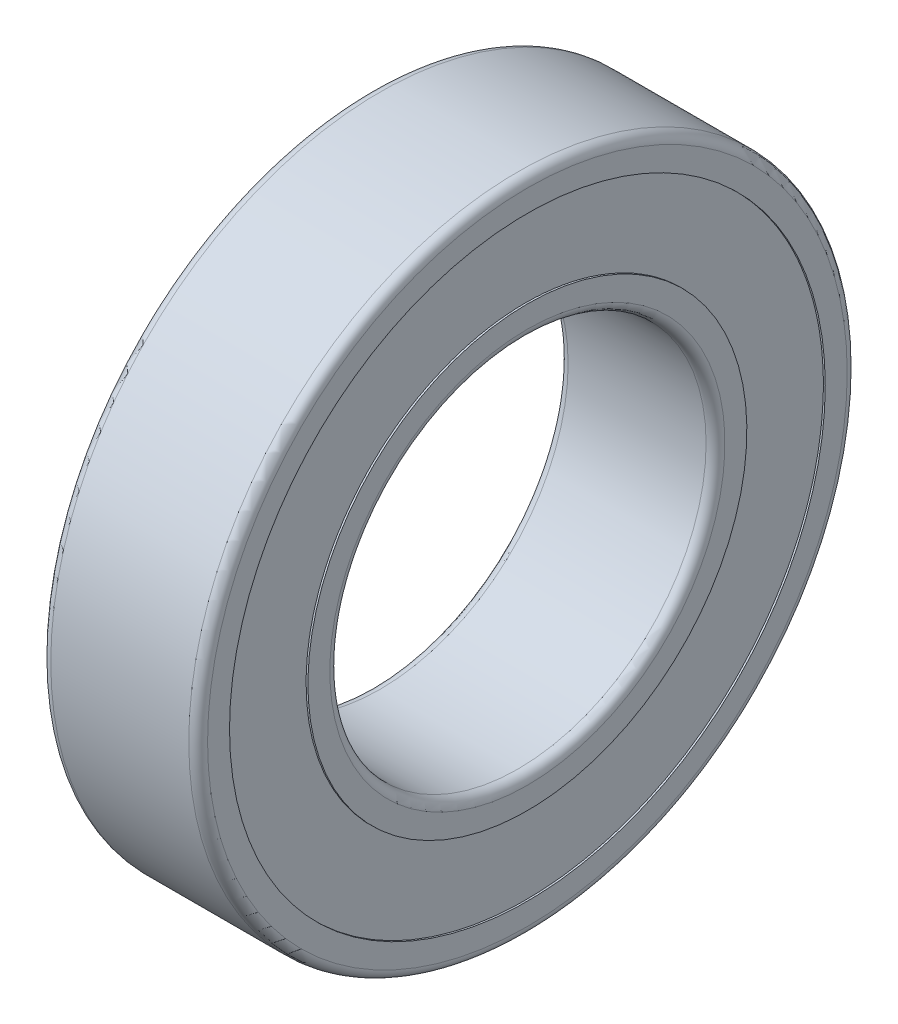
ISO-10303-21;
HEADER;
FILE_DESCRIPTION(('STEP AP214'),'2;1');
FILE_NAME('part.step','',(''),(''),'','','');
FILE_SCHEMA(('AUTOMOTIVE_DESIGN { 1 0 10303 214 1 1 1 1 }'));
ENDSEC;
DATA;
#1=APPLICATION_CONTEXT('core data for automotive mechanical design processes');
#2=APPLICATION_PROTOCOL_DEFINITION('international standard','automotive_design',2000,#1);
#3=PRODUCT_CONTEXT('',#1,'mechanical');
#4=PRODUCT('Part','Part','',(#3));
#5=PRODUCT_RELATED_PRODUCT_CATEGORY('part','',(#4));
#6=PRODUCT_DEFINITION_FORMATION('','',#4);
#7=PRODUCT_DEFINITION_CONTEXT('part definition',#1,'design');
#8=PRODUCT_DEFINITION('design','',#6,#7);
#9=PRODUCT_DEFINITION_SHAPE('','',#8);
#10=(LENGTH_UNIT() NAMED_UNIT(*) SI_UNIT(.MILLI.,.METRE.));
#11=(NAMED_UNIT(*) PLANE_ANGLE_UNIT() SI_UNIT($,.RADIAN.));
#12=(NAMED_UNIT(*) SI_UNIT($,.STERADIAN.) SOLID_ANGLE_UNIT());
#13=UNCERTAINTY_MEASURE_WITH_UNIT(LENGTH_MEASURE(1.E-05),#10,'distance_accuracy_value','');
#14=(GEOMETRIC_REPRESENTATION_CONTEXT(3) GLOBAL_UNCERTAINTY_ASSIGNED_CONTEXT((#13)) GLOBAL_UNIT_ASSIGNED_CONTEXT((#10,
#11,#12)) REPRESENTATION_CONTEXT('',''));
#15=CARTESIAN_POINT('',(0.,0.,0.));
#16=DIRECTION('',(0.,0.,1.));
#17=DIRECTION('',(1.,0.,0.));
#18=AXIS2_PLACEMENT_3D('',#15,#16,#17);
#19=CARTESIAN_POINT('',(0.,-10.4787043681198,-10.2));
#20=DIRECTION('',(-1.,0.,0.));
#21=DIRECTION('',(0.,0.,1.));
#22=AXIS2_PLACEMENT_3D('',#19,#20,#21);
#23=PLANE('',#22);
#24=CARTESIAN_POINT('',(0.,0.,0.));
#25=DIRECTION('',(-1.,0.,0.));
#26=DIRECTION('',(0.,0.,-1.));
#27=AXIS2_PLACEMENT_3D('',#24,#25,#26);
#28=CIRCLE('',#27,10.2);
#29=CARTESIAN_POINT('',(0.,0.,-10.2));
#30=VERTEX_POINT('',#29);
#31=EDGE_CURVE('P0_E55',#30,#30,#28,.F.);
#32=ORIENTED_EDGE('',*,*,#31,.F.);
#33=EDGE_LOOP('',(#32));
#34=FACE_BOUND('',#33,.T.);
#35=CARTESIAN_POINT('',(0.,0.,0.));
#36=DIRECTION('',(1.,0.,0.));
#37=DIRECTION('',(0.,0.,1.));
#38=AXIS2_PLACEMENT_3D('',#35,#36,#37);
#39=CIRCLE('',#38,9.5);
#40=CARTESIAN_POINT('',(0.,0.,9.5));
#41=VERTEX_POINT('',#40);
#42=EDGE_CURVE('P0_E52',#41,#41,#39,.T.);
#43=ORIENTED_EDGE('',*,*,#42,.T.);
#44=EDGE_LOOP('',(#43));
#45=FACE_BOUND('',#44,.T.);
#46=ADVANCED_FACE('P0_F14',(#34,#45),#23,.T.);
#47=CARTESIAN_POINT('',(0.23,-9.75957759775868,-9.5));
#48=DIRECTION('',(-1.,0.,0.));
#49=DIRECTION('',(0.,0.,1.));
#50=AXIS2_PLACEMENT_3D('',#47,#48,#49);
#51=PLANE('',#50);
#52=CARTESIAN_POINT('',(0.23,0.,0.));
#53=DIRECTION('',(-1.,0.,0.));
#54=DIRECTION('',(0.,0.,-1.));
#55=AXIS2_PLACEMENT_3D('',#52,#53,#54);
#56=CIRCLE('',#55,9.5);
#57=CARTESIAN_POINT('',(0.23,0.,-9.5));
#58=VERTEX_POINT('',#57);
#59=EDGE_CURVE('P0_E49',#58,#58,#56,.F.);
#60=ORIENTED_EDGE('',*,*,#59,.F.);
#61=EDGE_LOOP('',(#60));
#62=FACE_BOUND('',#61,.T.);
#63=CARTESIAN_POINT('',(0.23,0.,0.));
#64=DIRECTION('',(1.,0.,0.));
#65=DIRECTION('',(0.,-1.16860614848858E-09,1.));
#66=AXIS2_PLACEMENT_3D('',#63,#64,#65);
#67=CIRCLE('',#66,9.075);
#68=CARTESIAN_POINT('',(0.23,-1.06051007975339E-08,9.075));
#69=VERTEX_POINT('',#68);
#70=EDGE_CURVE('P0_E46',#69,#69,#67,.T.);
#71=ORIENTED_EDGE('',*,*,#70,.T.);
#72=EDGE_LOOP('',(#71));
#73=FACE_BOUND('',#72,.T.);
#74=ADVANCED_FACE('P0_F63',(#62,#73),#51,.T.);
#75=CARTESIAN_POINT('',(4.77,-9.75957759775868,9.5));
#76=DIRECTION('',(1.,0.,0.));
#77=DIRECTION('',(0.,0.,-1.));
#78=AXIS2_PLACEMENT_3D('',#75,#76,#77);
#79=PLANE('',#78);
#80=CARTESIAN_POINT('',(4.77,0.,0.));
#81=DIRECTION('',(1.,0.,0.));
#82=DIRECTION('',(0.,0.,1.));
#83=AXIS2_PLACEMENT_3D('',#80,#81,#82);
#84=CIRCLE('',#83,9.5);
#85=CARTESIAN_POINT('',(4.77,0.,9.5));
#86=VERTEX_POINT('',#85);
#87=EDGE_CURVE('P0_E43',#86,#86,#84,.T.);
#88=ORIENTED_EDGE('',*,*,#87,.T.);
#89=EDGE_LOOP('',(#88));
#90=FACE_BOUND('',#89,.T.);
#91=CARTESIAN_POINT('',(4.77,0.,0.));
#92=DIRECTION('',(-1.,0.,0.));
#93=DIRECTION('',(0.,0.,-1.));
#94=AXIS2_PLACEMENT_3D('',#91,#92,#93);
#95=CIRCLE('',#94,9.075);
#96=CARTESIAN_POINT('',(4.77,0.,-9.075));
#97=VERTEX_POINT('',#96);
#98=EDGE_CURVE('P0_E40',#97,#97,#95,.F.);
#99=ORIENTED_EDGE('',*,*,#98,.F.);
#100=EDGE_LOOP('',(#99));
#101=FACE_BOUND('',#100,.T.);
#102=ADVANCED_FACE('P0_F82',(#90,#101),#79,.T.);
#103=CARTESIAN_POINT('',(5.,-10.4787043681198,10.2));
#104=DIRECTION('',(1.,0.,0.));
#105=DIRECTION('',(0.,0.,-1.));
#106=AXIS2_PLACEMENT_3D('',#103,#104,#105);
#107=PLANE('',#106);
#108=CARTESIAN_POINT('',(5.,0.,0.));
#109=DIRECTION('',(1.,0.,0.));
#110=DIRECTION('',(0.,0.,1.));
#111=AXIS2_PLACEMENT_3D('',#108,#109,#110);
#112=CIRCLE('',#111,10.2);
#113=CARTESIAN_POINT('',(5.,0.,10.2));
#114=VERTEX_POINT('',#113);
#115=EDGE_CURVE('P0_E37',#114,#114,#112,.T.);
#116=ORIENTED_EDGE('',*,*,#115,.T.);
#117=EDGE_LOOP('',(#116));
#118=FACE_BOUND('',#117,.T.);
#119=CARTESIAN_POINT('',(5.,0.,0.));
#120=DIRECTION('',(-1.,0.,0.));
#121=DIRECTION('',(0.,0.,-1.));
#122=AXIS2_PLACEMENT_3D('',#119,#120,#121);
#123=CIRCLE('',#122,9.5);
#124=CARTESIAN_POINT('',(5.,0.,-9.5));
#125=VERTEX_POINT('',#124);
#126=EDGE_CURVE('P0_E34',#125,#125,#123,.F.);
#127=ORIENTED_EDGE('',*,*,#126,.F.);
#128=EDGE_LOOP('',(#127));
#129=FACE_BOUND('',#128,.T.);
#130=ADVANCED_FACE('P0_F70',(#118,#129),#107,.T.);
#131=CARTESIAN_POINT('',(5.,0.,0.));
#132=DIRECTION('',(1.,0.,0.));
#133=DIRECTION('',(0.,0.,1.));
#134=AXIS2_PLACEMENT_3D('',#131,#132,#133);
#135=CYLINDRICAL_SURFACE('',#134,9.5);
#136=ORIENTED_EDGE('',*,*,#59,.T.);
#137=EDGE_LOOP('',(#136));
#138=FACE_BOUND('',#137,.T.);
#139=ORIENTED_EDGE('',*,*,#42,.F.);
#140=EDGE_LOOP('',(#139));
#141=FACE_BOUND('',#140,.T.);
#142=ADVANCED_FACE('P0_F67',(#138,#141),#135,.F.);
#143=CARTESIAN_POINT('',(5.,0.,0.));
#144=DIRECTION('',(1.,0.,0.));
#145=DIRECTION('',(0.,0.,1.));
#146=AXIS2_PLACEMENT_3D('',#143,#144,#145);
#147=CYLINDRICAL_SURFACE('',#146,9.075);
#148=CARTESIAN_POINT('',(1.7351470729611,0.,0.));
#149=DIRECTION('',(1.,0.,0.));
#150=DIRECTION('',(0.,0.,1.));
#151=AXIS2_PLACEMENT_3D('',#148,#149,#150);
#152=CIRCLE('',#151,9.075);
#153=CARTESIAN_POINT('',(1.7351470729611,0.,9.075));
#154=VERTEX_POINT('',#153);
#155=EDGE_CURVE('P0_E29',#154,#154,#152,.T.);
#156=ORIENTED_EDGE('',*,*,#155,.T.);
#157=EDGE_LOOP('',(#156));
#158=FACE_BOUND('',#157,.T.);
#159=ORIENTED_EDGE('',*,*,#70,.F.);
#160=EDGE_LOOP('',(#159));
#161=FACE_BOUND('',#160,.T.);
#162=ADVANCED_FACE('P0_F69',(#158,#161),#147,.F.);
#163=CARTESIAN_POINT('',(2.5,0.,0.));
#164=DIRECTION('',(1.,0.,0.));
#165=DIRECTION('',(0.,0.,1.));
#166=AXIS2_PLACEMENT_3D('',#163,#164,#165);
#167=TOROIDAL_SURFACE('',#166,8.25,1.12499999999995);
#168=ORIENTED_EDGE('',*,*,#155,.F.);
#169=EDGE_LOOP('',(#168));
#170=FACE_BOUND('',#169,.T.);
#171=CARTESIAN_POINT('',(3.26485292703887,0.,0.));
#172=DIRECTION('',(1.,0.,0.));
#173=DIRECTION('',(0.,-1.9234246383795E-10,1.));
#174=AXIS2_PLACEMENT_3D('',#171,#172,#173);
#175=CIRCLE('',#174,9.07499999999998);
#176=CARTESIAN_POINT('',(3.26485292703887,-1.74550785932939E-09,9.07499999999998));
#177=VERTEX_POINT('',#176);
#178=EDGE_CURVE('P0_E25',#177,#177,#175,.T.);
#179=ORIENTED_EDGE('',*,*,#178,.T.);
#180=EDGE_LOOP('',(#179));
#181=FACE_BOUND('',#180,.T.);
#182=ADVANCED_FACE('P0_F79',(#170,#181),#167,.F.);
#183=CARTESIAN_POINT('',(5.,0.,0.));
#184=DIRECTION('',(1.,0.,0.));
#185=DIRECTION('',(0.,0.,1.));
#186=AXIS2_PLACEMENT_3D('',#183,#184,#185);
#187=CYLINDRICAL_SURFACE('',#186,9.075);
#188=ORIENTED_EDGE('',*,*,#98,.T.);
#189=EDGE_LOOP('',(#188));
#190=FACE_BOUND('',#189,.T.);
#191=ORIENTED_EDGE('',*,*,#178,.F.);
#192=EDGE_LOOP('',(#191));
#193=FACE_BOUND('',#192,.T.);
#194=ADVANCED_FACE('P0_F89',(#190,#193),#187,.F.);
#195=CARTESIAN_POINT('',(5.,0.,0.));
#196=DIRECTION('',(1.,0.,0.));
#197=DIRECTION('',(0.,0.,1.));
#198=AXIS2_PLACEMENT_3D('',#195,#196,#197);
#199=CYLINDRICAL_SURFACE('',#198,9.5);
#200=ORIENTED_EDGE('',*,*,#126,.T.);
#201=EDGE_LOOP('',(#200));
#202=FACE_BOUND('',#201,.T.);
#203=ORIENTED_EDGE('',*,*,#87,.F.);
#204=EDGE_LOOP('',(#203));
#205=FACE_BOUND('',#204,.T.);
#206=ADVANCED_FACE('P0_F93',(#202,#205),#199,.F.);
#207=CARTESIAN_POINT('',(4.70000000000012,0.,0.));
#208=DIRECTION('',(1.,0.,0.));
#209=DIRECTION('',(0.,0.,1.));
#210=AXIS2_PLACEMENT_3D('',#207,#208,#209);
#211=TOROIDAL_SURFACE('',#210,10.2000000000001,0.29999999999988);
#212=CARTESIAN_POINT('',(4.70000000000012,0.,0.));
#213=DIRECTION('',(1.,0.,0.));
#214=DIRECTION('',(0.,0.,1.));
#215=AXIS2_PLACEMENT_3D('',#212,#213,#214);
#216=CIRCLE('',#215,10.5);
#217=CARTESIAN_POINT('',(4.70000000000012,0.,10.5));
#218=VERTEX_POINT('',#217);
#219=EDGE_CURVE('P0_E21',#218,#218,#216,.T.);
#220=ORIENTED_EDGE('',*,*,#219,.T.);
#221=EDGE_LOOP('',(#220));
#222=FACE_BOUND('',#221,.T.);
#223=ORIENTED_EDGE('',*,*,#115,.F.);
#224=EDGE_LOOP('',(#223));
#225=FACE_BOUND('',#224,.T.);
#226=ADVANCED_FACE('P0_F97',(#222,#225),#211,.T.);
#227=CARTESIAN_POINT('',(5.,0.,0.));
#228=DIRECTION('',(1.,0.,0.));
#229=DIRECTION('',(0.,0.,1.));
#230=AXIS2_PLACEMENT_3D('',#227,#228,#229);
#231=CYLINDRICAL_SURFACE('',#230,10.5);
#232=CARTESIAN_POINT('',(0.3,0.,0.));
#233=DIRECTION('',(1.,0.,0.));
#234=DIRECTION('',(0.,0.,1.));
#235=AXIS2_PLACEMENT_3D('',#232,#233,#234);
#236=CIRCLE('',#235,10.5);
#237=CARTESIAN_POINT('',(0.3,0.,10.5));
#238=VERTEX_POINT('',#237);
#239=EDGE_CURVE('P0_E9',#238,#238,#236,.T.);
#240=ORIENTED_EDGE('',*,*,#239,.T.);
#241=EDGE_LOOP('',(#240));
#242=FACE_BOUND('',#241,.T.);
#243=ORIENTED_EDGE('',*,*,#219,.F.);
#244=EDGE_LOOP('',(#243));
#245=FACE_BOUND('',#244,.T.);
#246=ADVANCED_FACE('P0_F100',(#242,#245),#231,.T.);
#247=CARTESIAN_POINT('',(0.29999999999994,0.,0.));
#248=DIRECTION('',(1.,0.,0.));
#249=DIRECTION('',(0.,0.,1.));
#250=AXIS2_PLACEMENT_3D('',#247,#248,#249);
#251=TOROIDAL_SURFACE('',#250,10.2,0.299999999999939);
#252=ORIENTED_EDGE('',*,*,#31,.T.);
#253=EDGE_LOOP('',(#252));
#254=FACE_BOUND('',#253,.T.);
#255=ORIENTED_EDGE('',*,*,#239,.F.);
#256=EDGE_LOOP('',(#255));
#257=FACE_BOUND('',#256,.T.);
#258=ADVANCED_FACE('P0_F16',(#254,#257),#251,.T.);
#259=CLOSED_SHELL('',(#46,#74,#102,#130,#142,#162,#182,#194,#206,#226,#246,#258));
#260=MANIFOLD_SOLID_BREP('P0_B1',#259);
#261=CARTESIAN_POINT('',(2.5,-1.9743542303724,8.0102699937649));
#262=DIRECTION('',(-1.,0.,0.));
#263=DIRECTION('',(0.,0.,1.));
#264=AXIS2_PLACEMENT_3D('',#261,#262,#263);
#265=SPHERICAL_SURFACE('',#264,1.125);
#266=CARTESIAN_POINT('',(1.375,-1.9743542303724,8.0102699937649));
#267=VERTEX_POINT('',#266);
#268=VERTEX_LOOP('',#267);
#269=FACE_BOUND('',#268,.T.);
#270=ADVANCED_FACE('P1_F13',(#269),#265,.T.);
#271=CLOSED_SHELL('',(#270));
#272=MANIFOLD_SOLID_BREP('P1_B1',#271);
#273=CARTESIAN_POINT('',(2.5,5.4707619304866,6.1752136724116));
#274=DIRECTION('',(-1.,0.,0.));
#275=DIRECTION('',(0.,0.,1.));
#276=AXIS2_PLACEMENT_3D('',#273,#274,#275);
#277=SPHERICAL_SURFACE('',#276,1.125);
#278=CARTESIAN_POINT('',(1.375,5.4707619304866,6.1752136724116));
#279=VERTEX_POINT('',#278);
#280=VERTEX_LOOP('',#279);
#281=FACE_BOUND('',#280,.T.);
#282=ADVANCED_FACE('P2_F13',(#281),#277,.T.);
#283=CLOSED_SHELL('',(#282));
#284=MANIFOLD_SOLID_BREP('P2_B1',#283);
#285=CARTESIAN_POINT('',(2.5,1.9743542303724,8.0102699937649));
#286=DIRECTION('',(-1.,0.,0.));
#287=DIRECTION('',(0.,0.,1.));
#288=AXIS2_PLACEMENT_3D('',#285,#286,#287);
#289=SPHERICAL_SURFACE('',#288,1.125);
#290=CARTESIAN_POINT('',(1.375,1.9743542303724,8.0102699937649));
#291=VERTEX_POINT('',#290);
#292=VERTEX_LOOP('',#291);
#293=FACE_BOUND('',#292,.T.);
#294=ADVANCED_FACE('P3_F13',(#293),#289,.T.);
#295=CLOSED_SHELL('',(#294));
#296=MANIFOLD_SOLID_BREP('P3_B1',#295);
#297=CARTESIAN_POINT('',(2.5,-6.7896168936227,-4.686534160532));
#298=DIRECTION('',(-1.,0.,0.));
#299=DIRECTION('',(0.,0.,1.));
#300=AXIS2_PLACEMENT_3D('',#297,#298,#299);
#301=SPHERICAL_SURFACE('',#300,1.125);
#302=CARTESIAN_POINT('',(1.375,-6.7896168936227,-4.686534160532));
#303=VERTEX_POINT('',#302);
#304=VERTEX_LOOP('',#303);
#305=FACE_BOUND('',#304,.T.);
#306=ADVANCED_FACE('P4_F13',(#305),#301,.T.);
#307=CLOSED_SHELL('',(#306));
#308=MANIFOLD_SOLID_BREP('P4_B1',#307);
#309=CARTESIAN_POINT('',(4.77,-9.75957759775868,-9.5));
#310=DIRECTION('',(-1.,0.,0.));
#311=DIRECTION('',(0.,0.,1.));
#312=AXIS2_PLACEMENT_3D('',#309,#310,#311);
#313=PLANE('',#312);
#314=CARTESIAN_POINT('',(4.77,0.,0.));
#315=DIRECTION('',(-1.,0.,0.));
#316=DIRECTION('',(0.,0.,-1.));
#317=AXIS2_PLACEMENT_3D('',#314,#315,#316);
#318=CIRCLE('',#317,9.5);
#319=CARTESIAN_POINT('',(4.77,0.,-9.5));
#320=VERTEX_POINT('',#319);
#321=EDGE_CURVE('P5_E30',#320,#320,#318,.F.);
#322=ORIENTED_EDGE('',*,*,#321,.F.);
#323=EDGE_LOOP('',(#322));
#324=FACE_BOUND('',#323,.T.);
#325=CARTESIAN_POINT('',(4.77,0.,0.));
#326=DIRECTION('',(1.,0.,0.));
#327=DIRECTION('',(0.,0.,1.));
#328=AXIS2_PLACEMENT_3D('',#325,#326,#327);
#329=CIRCLE('',#328,7.);
#330=CARTESIAN_POINT('',(4.77,0.,7.));
#331=VERTEX_POINT('',#330);
#332=EDGE_CURVE('P5_E26',#331,#331,#329,.T.);
#333=ORIENTED_EDGE('',*,*,#332,.T.);
#334=EDGE_LOOP('',(#333));
#335=FACE_BOUND('',#334,.T.);
#336=ADVANCED_FACE('P5_F15',(#324,#335),#313,.T.);
#337=CARTESIAN_POINT('',(4.9425,-9.75957759775868,9.5));
#338=DIRECTION('',(1.,0.,0.));
#339=DIRECTION('',(0.,0.,-1.));
#340=AXIS2_PLACEMENT_3D('',#337,#338,#339);
#341=PLANE('',#340);
#342=CARTESIAN_POINT('',(4.9425,0.,0.));
#343=DIRECTION('',(1.,0.,0.));
#344=DIRECTION('',(0.,0.,1.));
#345=AXIS2_PLACEMENT_3D('',#342,#343,#344);
#346=CIRCLE('',#345,9.5);
#347=CARTESIAN_POINT('',(4.9425,0.,9.5));
#348=VERTEX_POINT('',#347);
#349=EDGE_CURVE('P5_E22',#348,#348,#346,.T.);
#350=ORIENTED_EDGE('',*,*,#349,.T.);
#351=EDGE_LOOP('',(#350));
#352=FACE_BOUND('',#351,.T.);
#353=CARTESIAN_POINT('',(4.9425,0.,0.));
#354=DIRECTION('',(-1.,0.,0.));
#355=DIRECTION('',(0.,0.,-1.));
#356=AXIS2_PLACEMENT_3D('',#353,#354,#355);
#357=CIRCLE('',#356,7.);
#358=CARTESIAN_POINT('',(4.9425,0.,-7.));
#359=VERTEX_POINT('',#358);
#360=EDGE_CURVE('P5_E10',#359,#359,#357,.F.);
#361=ORIENTED_EDGE('',*,*,#360,.F.);
#362=EDGE_LOOP('',(#361));
#363=FACE_BOUND('',#362,.T.);
#364=ADVANCED_FACE('P5_F40',(#352,#363),#341,.T.);
#365=CARTESIAN_POINT('',(4.9425,0.,0.));
#366=DIRECTION('',(1.,0.,0.));
#367=DIRECTION('',(0.,0.,1.));
#368=AXIS2_PLACEMENT_3D('',#365,#366,#367);
#369=CYLINDRICAL_SURFACE('',#368,7.);
#370=ORIENTED_EDGE('',*,*,#360,.T.);
#371=EDGE_LOOP('',(#370));
#372=FACE_BOUND('',#371,.T.);
#373=ORIENTED_EDGE('',*,*,#332,.F.);
#374=EDGE_LOOP('',(#373));
#375=FACE_BOUND('',#374,.T.);
#376=ADVANCED_FACE('P5_F44',(#372,#375),#369,.F.);
#377=CARTESIAN_POINT('',(4.9425,0.,0.));
#378=DIRECTION('',(1.,0.,0.));
#379=DIRECTION('',(0.,0.,1.));
#380=AXIS2_PLACEMENT_3D('',#377,#378,#379);
#381=CYLINDRICAL_SURFACE('',#380,9.5);
#382=ORIENTED_EDGE('',*,*,#321,.T.);
#383=EDGE_LOOP('',(#382));
#384=FACE_BOUND('',#383,.T.);
#385=ORIENTED_EDGE('',*,*,#349,.F.);
#386=EDGE_LOOP('',(#385));
#387=FACE_BOUND('',#386,.T.);
#388=ADVANCED_FACE('P5_F17',(#384,#387),#381,.T.);
#389=CLOSED_SHELL('',(#336,#364,#376,#388));
#390=MANIFOLD_SOLID_BREP('P5_B1',#389);
#391=CARTESIAN_POINT('',(0.23,9.75957759775868,-9.5));
#392=DIRECTION('',(1.,0.,0.));
#393=DIRECTION('',(0.,0.,1.));
#394=AXIS2_PLACEMENT_3D('',#391,#392,#393);
#395=PLANE('',#394);
#396=CARTESIAN_POINT('',(0.23,0.,0.));
#397=DIRECTION('',(1.,0.,0.));
#398=DIRECTION('',(0.,0.,-1.));
#399=AXIS2_PLACEMENT_3D('',#396,#397,#398);
#400=CIRCLE('',#399,9.5);
#401=CARTESIAN_POINT('',(0.23,0.,-9.5));
#402=VERTEX_POINT('',#401);
#403=EDGE_CURVE('P6_E30',#402,#402,#400,.F.);
#404=ORIENTED_EDGE('',*,*,#403,.F.);
#405=EDGE_LOOP('',(#404));
#406=FACE_BOUND('',#405,.T.);
#407=CARTESIAN_POINT('',(0.23,0.,0.));
#408=DIRECTION('',(-1.,0.,0.));
#409=DIRECTION('',(0.,0.,1.));
#410=AXIS2_PLACEMENT_3D('',#407,#408,#409);
#411=CIRCLE('',#410,7.);
#412=CARTESIAN_POINT('',(0.23,0.,7.));
#413=VERTEX_POINT('',#412);
#414=EDGE_CURVE('P6_E26',#413,#413,#411,.T.);
#415=ORIENTED_EDGE('',*,*,#414,.T.);
#416=EDGE_LOOP('',(#415));
#417=FACE_BOUND('',#416,.T.);
#418=ADVANCED_FACE('P6_F15',(#406,#417),#395,.T.);
#419=CARTESIAN_POINT('',(0.0575,9.75957759775868,9.5));
#420=DIRECTION('',(-1.,0.,0.));
#421=DIRECTION('',(0.,0.,-1.));
#422=AXIS2_PLACEMENT_3D('',#419,#420,#421);
#423=PLANE('',#422);
#424=CARTESIAN_POINT('',(0.0575,0.,0.));
#425=DIRECTION('',(-1.,0.,0.));
#426=DIRECTION('',(0.,0.,1.));
#427=AXIS2_PLACEMENT_3D('',#424,#425,#426);
#428=CIRCLE('',#427,9.5);
#429=CARTESIAN_POINT('',(0.0575,0.,9.5));
#430=VERTEX_POINT('',#429);
#431=EDGE_CURVE('P6_E22',#430,#430,#428,.T.);
#432=ORIENTED_EDGE('',*,*,#431,.T.);
#433=EDGE_LOOP('',(#432));
#434=FACE_BOUND('',#433,.T.);
#435=CARTESIAN_POINT('',(0.0575,0.,0.));
#436=DIRECTION('',(1.,0.,0.));
#437=DIRECTION('',(0.,0.,-1.));
#438=AXIS2_PLACEMENT_3D('',#435,#436,#437);
#439=CIRCLE('',#438,7.);
#440=CARTESIAN_POINT('',(0.0575,0.,-7.));
#441=VERTEX_POINT('',#440);
#442=EDGE_CURVE('P6_E10',#441,#441,#439,.F.);
#443=ORIENTED_EDGE('',*,*,#442,.F.);
#444=EDGE_LOOP('',(#443));
#445=FACE_BOUND('',#444,.T.);
#446=ADVANCED_FACE('P6_F40',(#434,#445),#423,.T.);
#447=CARTESIAN_POINT('',(0.0575,0.,0.));
#448=DIRECTION('',(-1.,0.,0.));
#449=DIRECTION('',(0.,0.,1.));
#450=AXIS2_PLACEMENT_3D('',#447,#448,#449);
#451=CYLINDRICAL_SURFACE('',#450,7.);
#452=ORIENTED_EDGE('',*,*,#442,.T.);
#453=EDGE_LOOP('',(#452));
#454=FACE_BOUND('',#453,.T.);
#455=ORIENTED_EDGE('',*,*,#414,.F.);
#456=EDGE_LOOP('',(#455));
#457=FACE_BOUND('',#456,.T.);
#458=ADVANCED_FACE('P6_F44',(#454,#457),#451,.F.);
#459=CARTESIAN_POINT('',(0.0575,0.,0.));
#460=DIRECTION('',(-1.,0.,0.));
#461=DIRECTION('',(0.,0.,1.));
#462=AXIS2_PLACEMENT_3D('',#459,#460,#461);
#463=CYLINDRICAL_SURFACE('',#462,9.5);
#464=ORIENTED_EDGE('',*,*,#403,.T.);
#465=EDGE_LOOP('',(#464));
#466=FACE_BOUND('',#465,.T.);
#467=ORIENTED_EDGE('',*,*,#431,.F.);
#468=EDGE_LOOP('',(#467));
#469=FACE_BOUND('',#468,.T.);
#470=ADVANCED_FACE('P6_F17',(#466,#469),#463,.T.);
#471=CLOSED_SHELL('',(#418,#446,#458,#470));
#472=MANIFOLD_SOLID_BREP('P6_B1',#471);
#473=CARTESIAN_POINT('',(2.5,-8.1898482113089,-0.99442761210642));
#474=DIRECTION('',(-1.,0.,0.));
#475=DIRECTION('',(0.,0.,1.));
#476=AXIS2_PLACEMENT_3D('',#473,#474,#475);
#477=SPHERICAL_SURFACE('',#476,1.125);
#478=CARTESIAN_POINT('',(1.375,-8.1898482113089,-0.99442761210642));
#479=VERTEX_POINT('',#478);
#480=VERTEX_LOOP('',#479);
#481=FACE_BOUND('',#480,.T.);
#482=ADVANCED_FACE('P7_F13',(#481),#477,.T.);
#483=CLOSED_SHELL('',(#482));
#484=MANIFOLD_SOLID_BREP('P7_B1',#483);
#485=CARTESIAN_POINT('',(2.5,-7.7138840021547,2.9254903181009));
#486=DIRECTION('',(-1.,0.,0.));
#487=DIRECTION('',(0.,0.,1.));
#488=AXIS2_PLACEMENT_3D('',#485,#486,#487);
#489=SPHERICAL_SURFACE('',#488,1.125);
#490=CARTESIAN_POINT('',(1.375,-7.7138840021547,2.9254903181009));
#491=VERTEX_POINT('',#490);
#492=VERTEX_LOOP('',#491);
#493=FACE_BOUND('',#492,.T.);
#494=ADVANCED_FACE('P8_F13',(#493),#489,.T.);
#495=CLOSED_SHELL('',(#494));
#496=MANIFOLD_SOLID_BREP('P8_B1',#495);
#497=CARTESIAN_POINT('',(2.5,-3.8339661693611,-7.305012211639));
#498=DIRECTION('',(-1.,0.,0.));
#499=DIRECTION('',(0.,0.,1.));
#500=AXIS2_PLACEMENT_3D('',#497,#498,#499);
#501=SPHERICAL_SURFACE('',#500,1.125);
#502=CARTESIAN_POINT('',(1.375,-3.8339661693611,-7.305012211639));
#503=VERTEX_POINT('',#502);
#504=VERTEX_LOOP('',#503);
#505=FACE_BOUND('',#504,.T.);
#506=ADVANCED_FACE('P9_F13',(#505),#501,.T.);
#507=CLOSED_SHELL('',(#506));
#508=MANIFOLD_SOLID_BREP('P9_B1',#507);
#509=CARTESIAN_POINT('',(0.,-7.,7.19126770361165));
#510=DIRECTION('',(-1.,0.,0.));
#511=DIRECTION('',(0.,1.,0.));
#512=AXIS2_PLACEMENT_3D('',#509,#510,#511);
#513=PLANE('',#512);
#514=CARTESIAN_POINT('',(0.,0.,0.));
#515=DIRECTION('',(-1.,0.,0.));
#516=DIRECTION('',(0.,-1.,0.));
#517=AXIS2_PLACEMENT_3D('',#514,#515,#516);
#518=CIRCLE('',#517,7.);
#519=CARTESIAN_POINT('',(0.,-7.,0.));
#520=VERTEX_POINT('',#519);
#521=EDGE_CURVE('P10_E56',#520,#520,#518,.F.);
#522=ORIENTED_EDGE('',*,*,#521,.F.);
#523=EDGE_LOOP('',(#522));
#524=FACE_BOUND('',#523,.T.);
#525=CARTESIAN_POINT('',(0.,0.,0.));
#526=DIRECTION('',(1.,0.,0.));
#527=DIRECTION('',(0.,1.,0.));
#528=AXIS2_PLACEMENT_3D('',#525,#526,#527);
#529=CIRCLE('',#528,6.3);
#530=CARTESIAN_POINT('',(0.,6.3,0.));
#531=VERTEX_POINT('',#530);
#532=EDGE_CURVE('P10_E53',#531,#531,#529,.T.);
#533=ORIENTED_EDGE('',*,*,#532,.T.);
#534=EDGE_LOOP('',(#533));
#535=FACE_BOUND('',#534,.T.);
#536=ADVANCED_FACE('P10_F15',(#524,#535),#513,.T.);
#537=CARTESIAN_POINT('',(5.,7.,7.19126770361165));
#538=DIRECTION('',(1.,0.,0.));
#539=DIRECTION('',(0.,-1.,0.));
#540=AXIS2_PLACEMENT_3D('',#537,#538,#539);
#541=PLANE('',#540);
#542=CARTESIAN_POINT('',(5.,0.,0.));
#543=DIRECTION('',(1.,0.,0.));
#544=DIRECTION('',(0.,1.,0.));
#545=AXIS2_PLACEMENT_3D('',#542,#543,#544);
#546=CIRCLE('',#545,7.);
#547=CARTESIAN_POINT('',(5.,7.,0.));
#548=VERTEX_POINT('',#547);
#549=EDGE_CURVE('P10_E50',#548,#548,#546,.T.);
#550=ORIENTED_EDGE('',*,*,#549,.T.);
#551=EDGE_LOOP('',(#550));
#552=FACE_BOUND('',#551,.T.);
#553=CARTESIAN_POINT('',(5.,0.,0.));
#554=DIRECTION('',(-1.,0.,0.));
#555=DIRECTION('',(0.,-1.,0.));
#556=AXIS2_PLACEMENT_3D('',#553,#554,#555);
#557=CIRCLE('',#556,6.3);
#558=CARTESIAN_POINT('',(5.,-6.3,0.));
#559=VERTEX_POINT('',#558);
#560=EDGE_CURVE('P10_E47',#559,#559,#557,.F.);
#561=ORIENTED_EDGE('',*,*,#560,.F.);
#562=EDGE_LOOP('',(#561));
#563=FACE_BOUND('',#562,.T.);
#564=ADVANCED_FACE('P10_F64',(#552,#563),#541,.T.);
#565=CARTESIAN_POINT('',(4.77,7.39,7.59192404709859));
#566=DIRECTION('',(1.,0.,0.));
#567=DIRECTION('',(0.,-1.,0.));
#568=AXIS2_PLACEMENT_3D('',#565,#566,#567);
#569=PLANE('',#568);
#570=CARTESIAN_POINT('',(4.77,0.,0.));
#571=DIRECTION('',(1.,0.,0.));
#572=DIRECTION('',(0.,1.,0.));
#573=AXIS2_PLACEMENT_3D('',#570,#571,#572);
#574=CIRCLE('',#573,7.39);
#575=CARTESIAN_POINT('',(4.77,7.39,0.));
#576=VERTEX_POINT('',#575);
#577=EDGE_CURVE('P10_E44',#576,#576,#574,.T.);
#578=ORIENTED_EDGE('',*,*,#577,.T.);
#579=EDGE_LOOP('',(#578));
#580=FACE_BOUND('',#579,.T.);
#581=CARTESIAN_POINT('',(4.77,0.,0.));
#582=DIRECTION('',(-1.,0.,0.));
#583=DIRECTION('',(0.,-1.,0.));
#584=AXIS2_PLACEMENT_3D('',#581,#582,#583);
#585=CIRCLE('',#584,7.);
#586=CARTESIAN_POINT('',(4.77,-7.,0.));
#587=VERTEX_POINT('',#586);
#588=EDGE_CURVE('P10_E41',#587,#587,#585,.F.);
#589=ORIENTED_EDGE('',*,*,#588,.F.);
#590=EDGE_LOOP('',(#589));
#591=FACE_BOUND('',#590,.T.);
#592=ADVANCED_FACE('P10_F82',(#580,#591),#569,.T.);
#593=CARTESIAN_POINT('',(0.23,-7.39,7.59192404709859));
#594=DIRECTION('',(-1.,0.,0.));
#595=DIRECTION('',(0.,1.,0.));
#596=AXIS2_PLACEMENT_3D('',#593,#594,#595);
#597=PLANE('',#596);
#598=CARTESIAN_POINT('',(0.23,0.,0.));
#599=DIRECTION('',(-1.,0.,0.));
#600=DIRECTION('',(0.,-1.,0.));
#601=AXIS2_PLACEMENT_3D('',#598,#599,#600);
#602=CIRCLE('',#601,7.39);
#603=CARTESIAN_POINT('',(0.23,-7.39,0.));
#604=VERTEX_POINT('',#603);
#605=EDGE_CURVE('P10_E38',#604,#604,#602,.F.);
#606=ORIENTED_EDGE('',*,*,#605,.F.);
#607=EDGE_LOOP('',(#606));
#608=FACE_BOUND('',#607,.T.);
#609=CARTESIAN_POINT('',(0.23,0.,0.));
#610=DIRECTION('',(1.,0.,0.));
#611=DIRECTION('',(0.,1.,0.));
#612=AXIS2_PLACEMENT_3D('',#609,#610,#611);
#613=CIRCLE('',#612,7.);
#614=CARTESIAN_POINT('',(0.23,7.,0.));
#615=VERTEX_POINT('',#614);
#616=EDGE_CURVE('P10_E35',#615,#615,#613,.T.);
#617=ORIENTED_EDGE('',*,*,#616,.T.);
#618=EDGE_LOOP('',(#617));
#619=FACE_BOUND('',#618,.T.);
#620=ADVANCED_FACE('P10_F71',(#608,#619),#597,.T.);
#621=CARTESIAN_POINT('',(0.299999999999939,0.,0.));
#622=DIRECTION('',(1.,0.,0.));
#623=DIRECTION('',(0.,1.,0.));
#624=AXIS2_PLACEMENT_3D('',#621,#622,#623);
#625=TOROIDAL_SURFACE('',#624,6.3,0.299999999999939);
#626=CARTESIAN_POINT('',(0.3,0.,0.));
#627=DIRECTION('',(1.,0.,0.));
#628=DIRECTION('',(0.,1.,0.));
#629=AXIS2_PLACEMENT_3D('',#626,#627,#628);
#630=CIRCLE('',#629,6.00000000000006);
#631=CARTESIAN_POINT('',(0.3,6.00000000000006,0.));
#632=VERTEX_POINT('',#631);
#633=EDGE_CURVE('P10_E30',#632,#632,#630,.T.);
#634=ORIENTED_EDGE('',*,*,#633,.T.);
#635=EDGE_LOOP('',(#634));
#636=FACE_BOUND('',#635,.T.);
#637=ORIENTED_EDGE('',*,*,#532,.F.);
#638=EDGE_LOOP('',(#637));
#639=FACE_BOUND('',#638,.T.);
#640=ADVANCED_FACE('P10_F68',(#636,#639),#625,.T.);
#641=CARTESIAN_POINT('',(5.,0.,0.));
#642=DIRECTION('',(1.,0.,0.));
#643=DIRECTION('',(0.,1.,0.));
#644=AXIS2_PLACEMENT_3D('',#641,#642,#643);
#645=CYLINDRICAL_SURFACE('',#644,6.);
#646=CARTESIAN_POINT('',(4.7,0.,0.));
#647=DIRECTION('',(1.,0.,0.));
#648=DIRECTION('',(0.,1.,0.));
#649=AXIS2_PLACEMENT_3D('',#646,#647,#648);
#650=CIRCLE('',#649,6.);
#651=CARTESIAN_POINT('',(4.7,6.,0.));
#652=VERTEX_POINT('',#651);
#653=EDGE_CURVE('P10_E26',#652,#652,#650,.T.);
#654=ORIENTED_EDGE('',*,*,#653,.T.);
#655=EDGE_LOOP('',(#654));
#656=FACE_BOUND('',#655,.T.);
#657=ORIENTED_EDGE('',*,*,#633,.F.);
#658=EDGE_LOOP('',(#657));
#659=FACE_BOUND('',#658,.T.);
#660=ADVANCED_FACE('P10_F70',(#656,#659),#645,.F.);
#661=CARTESIAN_POINT('',(4.70000000000012,0.,0.));
#662=DIRECTION('',(1.,0.,0.));
#663=DIRECTION('',(0.,1.,0.));
#664=AXIS2_PLACEMENT_3D('',#661,#662,#663);
#665=TOROIDAL_SURFACE('',#664,6.29999999999988,0.299999999999877);
#666=ORIENTED_EDGE('',*,*,#560,.T.);
#667=EDGE_LOOP('',(#666));
#668=FACE_BOUND('',#667,.T.);
#669=ORIENTED_EDGE('',*,*,#653,.F.);
#670=EDGE_LOOP('',(#669));
#671=FACE_BOUND('',#670,.T.);
#672=ADVANCED_FACE('P10_F79',(#668,#671),#665,.T.);
#673=CARTESIAN_POINT('',(5.,0.,0.));
#674=DIRECTION('',(1.,0.,0.));
#675=DIRECTION('',(0.,1.,0.));
#676=AXIS2_PLACEMENT_3D('',#673,#674,#675);
#677=CYLINDRICAL_SURFACE('',#676,7.);
#678=ORIENTED_EDGE('',*,*,#588,.T.);
#679=EDGE_LOOP('',(#678));
#680=FACE_BOUND('',#679,.T.);
#681=ORIENTED_EDGE('',*,*,#549,.F.);
#682=EDGE_LOOP('',(#681));
#683=FACE_BOUND('',#682,.T.);
#684=ADVANCED_FACE('P10_F89',(#680,#683),#677,.T.);
#685=CARTESIAN_POINT('',(5.,0.,0.));
#686=DIRECTION('',(1.,0.,0.));
#687=DIRECTION('',(0.,1.,0.));
#688=AXIS2_PLACEMENT_3D('',#685,#686,#687);
#689=CYLINDRICAL_SURFACE('',#688,7.39);
#690=CARTESIAN_POINT('',(3.2252758096062,0.,0.));
#691=DIRECTION('',(1.,0.,0.));
#692=DIRECTION('',(0.,1.,0.));
#693=AXIS2_PLACEMENT_3D('',#690,#691,#692);
#694=CIRCLE('',#693,7.39);
#695=CARTESIAN_POINT('',(3.2252758096062,7.39,0.));
#696=VERTEX_POINT('',#695);
#697=EDGE_CURVE('P10_E22',#696,#696,#694,.T.);
#698=ORIENTED_EDGE('',*,*,#697,.T.);
#699=EDGE_LOOP('',(#698));
#700=FACE_BOUND('',#699,.T.);
#701=ORIENTED_EDGE('',*,*,#577,.F.);
#702=EDGE_LOOP('',(#701));
#703=FACE_BOUND('',#702,.T.);
#704=ADVANCED_FACE('P10_F93',(#700,#703),#689,.T.);
#705=CARTESIAN_POINT('',(2.5,0.,0.));
#706=DIRECTION('',(1.,0.,0.));
#707=DIRECTION('',(0.,1.,0.));
#708=AXIS2_PLACEMENT_3D('',#705,#706,#707);
#709=TOROIDAL_SURFACE('',#708,8.24999999999987,1.12499999999987);
#710=ORIENTED_EDGE('',*,*,#697,.F.);
#711=EDGE_LOOP('',(#710));
#712=FACE_BOUND('',#711,.T.);
#713=CARTESIAN_POINT('',(1.7747241903938,0.,0.));
#714=DIRECTION('',(1.,0.,0.));
#715=DIRECTION('',(0.,1.,0.));
#716=AXIS2_PLACEMENT_3D('',#713,#714,#715);
#717=CIRCLE('',#716,7.39);
#718=CARTESIAN_POINT('',(1.7747241903938,7.39,0.));
#719=VERTEX_POINT('',#718);
#720=EDGE_CURVE('P10_E10',#719,#719,#717,.T.);
#721=ORIENTED_EDGE('',*,*,#720,.T.);
#722=EDGE_LOOP('',(#721));
#723=FACE_BOUND('',#722,.T.);
#724=ADVANCED_FACE('P10_F97',(#712,#723),#709,.F.);
#725=CARTESIAN_POINT('',(5.,0.,0.));
#726=DIRECTION('',(1.,0.,0.));
#727=DIRECTION('',(0.,1.,-7.69344266411817E-10));
#728=AXIS2_PLACEMENT_3D('',#725,#726,#727);
#729=CYLINDRICAL_SURFACE('',#728,7.39);
#730=ORIENTED_EDGE('',*,*,#605,.T.);
#731=EDGE_LOOP('',(#730));
#732=FACE_BOUND('',#731,.T.);
#733=ORIENTED_EDGE('',*,*,#720,.F.);
#734=EDGE_LOOP('',(#733));
#735=FACE_BOUND('',#734,.T.);
#736=ADVANCED_FACE('P10_F99',(#732,#735),#729,.T.);
#737=CARTESIAN_POINT('',(5.,0.,0.));
#738=DIRECTION('',(1.,0.,0.));
#739=DIRECTION('',(0.,1.,0.));
#740=AXIS2_PLACEMENT_3D('',#737,#738,#739);
#741=CYLINDRICAL_SURFACE('',#740,7.);
#742=ORIENTED_EDGE('',*,*,#521,.T.);
#743=EDGE_LOOP('',(#742));
#744=FACE_BOUND('',#743,.T.);
#745=ORIENTED_EDGE('',*,*,#616,.F.);
#746=EDGE_LOOP('',(#745));
#747=FACE_BOUND('',#746,.T.);
#748=ADVANCED_FACE('P10_F17',(#744,#747),#741,.T.);
#749=CLOSED_SHELL('',(#536,#564,#592,#620,#640,#660,#672,#684,#704,#724,#736,#748));
#750=MANIFOLD_SOLID_BREP('P10_B1',#749);
#751=CARTESIAN_POINT('',(2.5,-5.4707619304866,6.1752136724116));
#752=DIRECTION('',(-1.,0.,0.));
#753=DIRECTION('',(0.,0.,1.));
#754=AXIS2_PLACEMENT_3D('',#751,#752,#753);
#755=SPHERICAL_SURFACE('',#754,1.125);
#756=CARTESIAN_POINT('',(1.375,-5.4707619304866,6.1752136724116));
#757=VERTEX_POINT('',#756);
#758=VERTEX_LOOP('',#757);
#759=FACE_BOUND('',#758,.T.);
#760=ADVANCED_FACE('P11_F13',(#759),#755,.T.);
#761=CLOSED_SHELL('',(#760));
#762=MANIFOLD_SOLID_BREP('P11_B1',#761);
#763=CARTESIAN_POINT('',(2.5,0.,-8.25));
#764=DIRECTION('',(-1.,0.,0.));
#765=DIRECTION('',(0.,0.,1.));
#766=AXIS2_PLACEMENT_3D('',#763,#764,#765);
#767=SPHERICAL_SURFACE('',#766,1.125);
#768=CARTESIAN_POINT('',(1.375,0.,-8.25));
#769=VERTEX_POINT('',#768);
#770=VERTEX_LOOP('',#769);
#771=FACE_BOUND('',#770,.T.);
#772=ADVANCED_FACE('P12_F13',(#771),#767,.T.);
#773=CLOSED_SHELL('',(#772));
#774=MANIFOLD_SOLID_BREP('P12_B1',#773);
#775=CARTESIAN_POINT('',(2.5,3.8339661693611,-7.305012211639));
#776=DIRECTION('',(-1.,0.,0.));
#777=DIRECTION('',(0.,0.,1.));
#778=AXIS2_PLACEMENT_3D('',#775,#776,#777);
#779=SPHERICAL_SURFACE('',#778,1.125);
#780=CARTESIAN_POINT('',(1.375,3.8339661693611,-7.305012211639));
#781=VERTEX_POINT('',#780);
#782=VERTEX_LOOP('',#781);
#783=FACE_BOUND('',#782,.T.);
#784=ADVANCED_FACE('P13_F13',(#783),#779,.T.);
#785=CLOSED_SHELL('',(#784));
#786=MANIFOLD_SOLID_BREP('P13_B1',#785);
#787=CARTESIAN_POINT('',(2.5,6.7896168936227,-4.686534160532));
#788=DIRECTION('',(-1.,0.,0.));
#789=DIRECTION('',(0.,0.,1.));
#790=AXIS2_PLACEMENT_3D('',#787,#788,#789);
#791=SPHERICAL_SURFACE('',#790,1.125);
#792=CARTESIAN_POINT('',(1.375,6.7896168936227,-4.686534160532));
#793=VERTEX_POINT('',#792);
#794=VERTEX_LOOP('',#793);
#795=FACE_BOUND('',#794,.T.);
#796=ADVANCED_FACE('P14_F13',(#795),#791,.T.);
#797=CLOSED_SHELL('',(#796));
#798=MANIFOLD_SOLID_BREP('P14_B1',#797);
#799=CARTESIAN_POINT('',(2.5,8.1898482113089,-0.99442761210641));
#800=DIRECTION('',(-1.,0.,0.));
#801=DIRECTION('',(0.,0.,1.));
#802=AXIS2_PLACEMENT_3D('',#799,#800,#801);
#803=SPHERICAL_SURFACE('',#802,1.125);
#804=CARTESIAN_POINT('',(1.375,8.1898482113089,-0.99442761210641));
#805=VERTEX_POINT('',#804);
#806=VERTEX_LOOP('',#805);
#807=FACE_BOUND('',#806,.T.);
#808=ADVANCED_FACE('P15_F13',(#807),#803,.T.);
#809=CLOSED_SHELL('',(#808));
#810=MANIFOLD_SOLID_BREP('P15_B1',#809);
#811=CARTESIAN_POINT('',(2.5,7.7138840021547,2.9254903181009));
#812=DIRECTION('',(-1.,0.,0.));
#813=DIRECTION('',(0.,0.,1.));
#814=AXIS2_PLACEMENT_3D('',#811,#812,#813);
#815=SPHERICAL_SURFACE('',#814,1.125);
#816=CARTESIAN_POINT('',(1.375,7.7138840021547,2.9254903181009));
#817=VERTEX_POINT('',#816);
#818=VERTEX_LOOP('',#817);
#819=FACE_BOUND('',#818,.T.);
#820=ADVANCED_FACE('P16_F13',(#819),#815,.T.);
#821=CLOSED_SHELL('',(#820));
#822=MANIFOLD_SOLID_BREP('P16_B1',#821);
#823=ADVANCED_BREP_SHAPE_REPRESENTATION('',(#18,#260,#272,#284,#296,#308,#390,#472,#484,#496,
#508,#750,#762,#774,#786,#798,#810,#822),#14);
#824=SHAPE_DEFINITION_REPRESENTATION(#9,#823);
ENDSEC;
END-ISO-10303-21;
